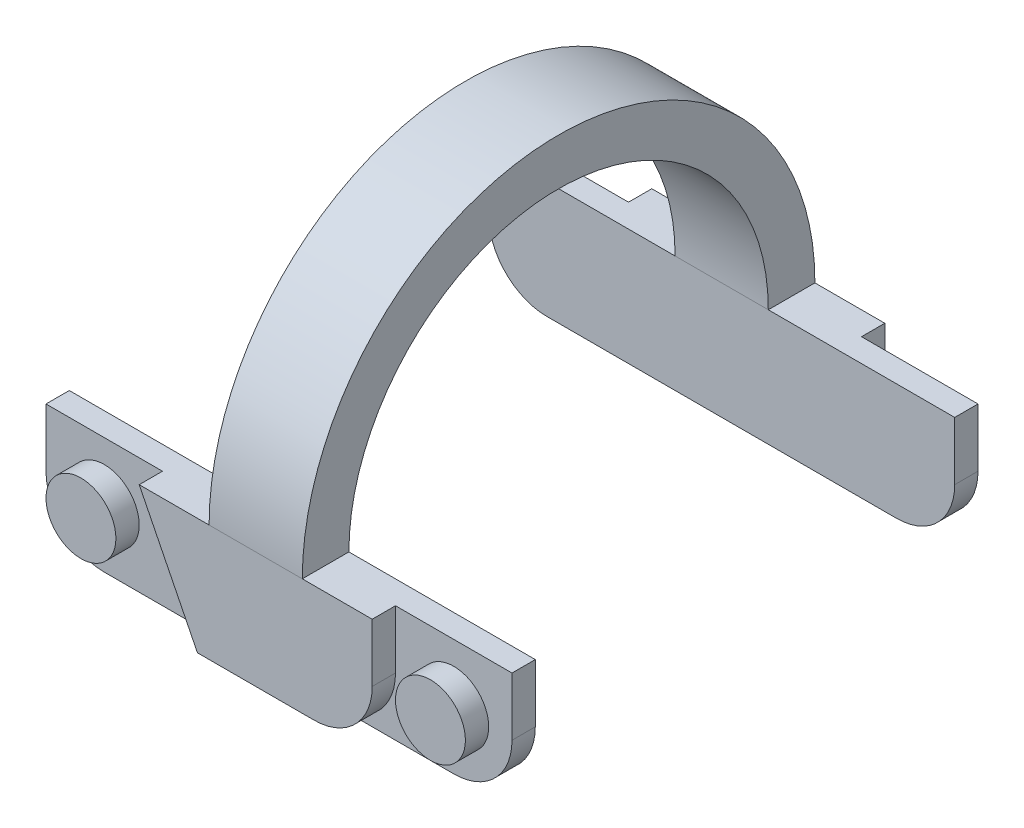
ISO-10303-21;
HEADER;
FILE_DESCRIPTION(('STEP AP214'),'2;1');
FILE_NAME('part.step','',(''),(''),'','','');
FILE_SCHEMA(('AUTOMOTIVE_DESIGN { 1 0 10303 214 1 1 1 1 }'));
ENDSEC;
DATA;
#1=APPLICATION_CONTEXT('core data for automotive mechanical design processes');
#2=APPLICATION_PROTOCOL_DEFINITION('international standard','automotive_design',2000,#1);
#3=PRODUCT_CONTEXT('',#1,'mechanical');
#4=PRODUCT('Part','Part','',(#3));
#5=PRODUCT_RELATED_PRODUCT_CATEGORY('part','',(#4));
#6=PRODUCT_DEFINITION_FORMATION('','',#4);
#7=PRODUCT_DEFINITION_CONTEXT('part definition',#1,'design');
#8=PRODUCT_DEFINITION('design','',#6,#7);
#9=PRODUCT_DEFINITION_SHAPE('','',#8);
#10=(LENGTH_UNIT() NAMED_UNIT(*) SI_UNIT(.MILLI.,.METRE.));
#11=(NAMED_UNIT(*) PLANE_ANGLE_UNIT() SI_UNIT($,.RADIAN.));
#12=(NAMED_UNIT(*) SI_UNIT($,.STERADIAN.) SOLID_ANGLE_UNIT());
#13=UNCERTAINTY_MEASURE_WITH_UNIT(LENGTH_MEASURE(1.E-05),#10,'distance_accuracy_value','');
#14=(GEOMETRIC_REPRESENTATION_CONTEXT(3) GLOBAL_UNCERTAINTY_ASSIGNED_CONTEXT((#13)) GLOBAL_UNIT_ASSIGNED_CONTEXT((#10,
#11,#12)) REPRESENTATION_CONTEXT('',''));
#15=CARTESIAN_POINT('',(0.,0.,0.));
#16=DIRECTION('',(0.,0.,1.));
#17=DIRECTION('',(1.,0.,0.));
#18=AXIS2_PLACEMENT_3D('',#15,#16,#17);
#19=CARTESIAN_POINT('',(0.,0.,10.));
#20=DIRECTION('',(0.,0.,1.));
#21=DIRECTION('',(1.,0.,0.));
#22=AXIS2_PLACEMENT_3D('',#19,#20,#21);
#23=PLANE('',#22);
#24=DIRECTION('',(0.,-1.,0.));
#25=VECTOR('',#24,1.);
#26=CARTESIAN_POINT('',(0.,2.5,10.));
#27=LINE('',#26,#25);
#28=CARTESIAN_POINT('',(0.,2.5,10.));
#29=VERTEX_POINT('',#28);
#30=CARTESIAN_POINT('',(0.,0.,10.));
#31=VERTEX_POINT('',#30);
#32=EDGE_CURVE('E326',#29,#31,#27,.T.);
#33=ORIENTED_EDGE('',*,*,#32,.T.);
#34=CARTESIAN_POINT('',(2.5,0.,10.));
#35=DIRECTION('',(0.,0.,1.));
#36=DIRECTION('',(1.,0.,0.));
#37=AXIS2_PLACEMENT_3D('',#34,#35,#36);
#38=CIRCLE('',#37,2.5);
#39=CARTESIAN_POINT('',(2.5,-2.5,10.));
#40=VERTEX_POINT('',#39);
#41=EDGE_CURVE('E389',#31,#40,#38,.T.);
#42=ORIENTED_EDGE('',*,*,#41,.T.);
#43=DIRECTION('',(1.,0.,0.));
#44=VECTOR('',#43,1.);
#45=CARTESIAN_POINT('',(0.,-2.5,10.));
#46=LINE('',#45,#44);
#47=CARTESIAN_POINT('',(7.5,-2.5,10.));
#48=VERTEX_POINT('',#47);
#49=EDGE_CURVE('E329',#40,#48,#46,.T.);
#50=ORIENTED_EDGE('',*,*,#49,.T.);
#51=DIRECTION('',(-0.447213595499958,0.894427190999916,0.));
#52=VECTOR('',#51,1.);
#53=CARTESIAN_POINT('',(5.,2.5,10.));
#54=LINE('',#53,#52);
#55=CARTESIAN_POINT('',(5.,2.5,10.));
#56=VERTEX_POINT('',#55);
#57=EDGE_CURVE('E437',#48,#56,#54,.T.);
#58=ORIENTED_EDGE('',*,*,#57,.T.);
#59=DIRECTION('',(-1.,0.,0.));
#60=VECTOR('',#59,1.);
#61=CARTESIAN_POINT('',(0.,2.5,10.));
#62=LINE('',#61,#60);
#63=EDGE_CURVE('E331',#56,#29,#62,.T.);
#64=ORIENTED_EDGE('',*,*,#63,.T.);
#65=EDGE_LOOP('',(#33,#42,#50,#58,#64));
#66=FACE_BOUND('',#65,.T.);
#67=CARTESIAN_POINT('',(2.5,0.,10.));
#68=DIRECTION('',(0.,0.,1.));
#69=DIRECTION('',(1.,0.,0.));
#70=AXIS2_PLACEMENT_3D('',#67,#68,#69);
#71=CIRCLE('',#70,1.5);
#72=CARTESIAN_POINT('',(4.,0.,10.));
#73=VERTEX_POINT('',#72);
#74=EDGE_CURVE('E444',#73,#73,#71,.T.);
#75=ORIENTED_EDGE('',*,*,#74,.F.);
#76=EDGE_LOOP('',(#75));
#77=FACE_BOUND('',#76,.T.);
#78=ADVANCED_FACE('F35',(#66,#77),#23,.T.);
#79=CARTESIAN_POINT('',(0.,0.,10.));
#80=DIRECTION('',(0.,0.,-1.));
#81=DIRECTION('',(-1.,0.,0.));
#82=AXIS2_PLACEMENT_3D('',#79,#80,#81);
#83=PLANE('',#82);
#84=DIRECTION('',(1.,0.,0.));
#85=VECTOR('',#84,1.);
#86=CARTESIAN_POINT('',(20.,-2.5,10.));
#87=LINE('',#86,#85);
#88=CARTESIAN_POINT('',(12.5,-2.5,10.));
#89=VERTEX_POINT('',#88);
#90=CARTESIAN_POINT('',(17.5,-2.5,10.));
#91=VERTEX_POINT('',#90);
#92=EDGE_CURVE('E319',#89,#91,#87,.T.);
#93=ORIENTED_EDGE('',*,*,#92,.T.);
#94=CARTESIAN_POINT('',(17.5,0.,10.));
#95=DIRECTION('',(0.,0.,-1.));
#96=DIRECTION('',(-1.,0.,0.));
#97=AXIS2_PLACEMENT_3D('',#94,#95,#96);
#98=CIRCLE('',#97,2.5);
#99=CARTESIAN_POINT('',(20.,0.,10.));
#100=VERTEX_POINT('',#99);
#101=EDGE_CURVE('E399',#91,#100,#98,.F.);
#102=ORIENTED_EDGE('',*,*,#101,.T.);
#103=DIRECTION('',(0.,1.,0.));
#104=VECTOR('',#103,1.);
#105=CARTESIAN_POINT('',(20.,2.5,10.));
#106=LINE('',#105,#104);
#107=CARTESIAN_POINT('',(20.,2.5,10.));
#108=VERTEX_POINT('',#107);
#109=EDGE_CURVE('E311',#100,#108,#106,.T.);
#110=ORIENTED_EDGE('',*,*,#109,.T.);
#111=DIRECTION('',(-1.,0.,0.));
#112=VECTOR('',#111,1.);
#113=CARTESIAN_POINT('',(20.,2.5,10.));
#114=LINE('',#113,#112);
#115=CARTESIAN_POINT('',(15.,2.5,10.));
#116=VERTEX_POINT('',#115);
#117=EDGE_CURVE('E313',#108,#116,#114,.T.);
#118=ORIENTED_EDGE('',*,*,#117,.T.);
#119=DIRECTION('',(0.,-1.,0.));
#120=VECTOR('',#119,1.);
#121=CARTESIAN_POINT('',(15.,2.5,10.));
#122=LINE('',#121,#120);
#123=CARTESIAN_POINT('',(15.,0.,10.));
#124=VERTEX_POINT('',#123);
#125=EDGE_CURVE('E316',#116,#124,#122,.T.);
#126=ORIENTED_EDGE('',*,*,#125,.T.);
#127=CARTESIAN_POINT('',(12.5,0.,10.));
#128=DIRECTION('',(0.,0.,-1.));
#129=DIRECTION('',(-1.,0.,0.));
#130=AXIS2_PLACEMENT_3D('',#127,#128,#129);
#131=CIRCLE('',#130,2.5);
#132=EDGE_CURVE('E43',#124,#89,#131,.T.);
#133=ORIENTED_EDGE('',*,*,#132,.T.);
#134=EDGE_LOOP('',(#93,#102,#110,#118,#126,#133));
#135=FACE_BOUND('',#134,.T.);
#136=CARTESIAN_POINT('',(17.5,0.,10.));
#137=DIRECTION('',(0.,0.,-1.));
#138=DIRECTION('',(-1.,0.,0.));
#139=AXIS2_PLACEMENT_3D('',#136,#137,#138);
#140=CIRCLE('',#139,1.5);
#141=CARTESIAN_POINT('',(16.,0.,10.));
#142=VERTEX_POINT('',#141);
#143=EDGE_CURVE('E362',#142,#142,#140,.F.);
#144=ORIENTED_EDGE('',*,*,#143,.F.);
#145=EDGE_LOOP('',(#144));
#146=FACE_BOUND('',#145,.T.);
#147=ADVANCED_FACE('F417',(#135,#146),#83,.F.);
#148=CARTESIAN_POINT('',(0.,0.,-10.));
#149=DIRECTION('',(0.,0.,-1.));
#150=DIRECTION('',(0.,1.,0.));
#151=AXIS2_PLACEMENT_3D('',#148,#149,#150);
#152=PLANE('',#151);
#153=DIRECTION('',(0.,-1.,0.));
#154=VECTOR('',#153,1.);
#155=CARTESIAN_POINT('',(20.,2.5,-10.));
#156=LINE('',#155,#154);
#157=CARTESIAN_POINT('',(20.,2.5,-10.));
#158=VERTEX_POINT('',#157);
#159=CARTESIAN_POINT('',(20.,0.,-10.));
#160=VERTEX_POINT('',#159);
#161=EDGE_CURVE('E239',#158,#160,#156,.T.);
#162=ORIENTED_EDGE('',*,*,#161,.T.);
#163=CARTESIAN_POINT('',(17.5,0.,-10.));
#164=DIRECTION('',(0.,0.,-1.));
#165=DIRECTION('',(0.,1.,0.));
#166=AXIS2_PLACEMENT_3D('',#163,#164,#165);
#167=CIRCLE('',#166,2.5);
#168=CARTESIAN_POINT('',(17.5,-2.5,-10.));
#169=VERTEX_POINT('',#168);
#170=EDGE_CURVE('E394',#160,#169,#167,.T.);
#171=ORIENTED_EDGE('',*,*,#170,.T.);
#172=DIRECTION('',(-1.,0.,0.));
#173=VECTOR('',#172,1.);
#174=CARTESIAN_POINT('',(20.,-2.5,-10.));
#175=LINE('',#174,#173);
#176=CARTESIAN_POINT('',(12.5,-2.5,-10.));
#177=VERTEX_POINT('',#176);
#178=EDGE_CURVE('E49',#169,#177,#175,.T.);
#179=ORIENTED_EDGE('',*,*,#178,.T.);
#180=CARTESIAN_POINT('',(12.5,0.,-10.));
#181=DIRECTION('',(0.,0.,-1.));
#182=DIRECTION('',(0.,1.,0.));
#183=AXIS2_PLACEMENT_3D('',#180,#181,#182);
#184=CIRCLE('',#183,2.5);
#185=CARTESIAN_POINT('',(15.,0.,-10.));
#186=VERTEX_POINT('',#185);
#187=EDGE_CURVE('E11',#177,#186,#184,.F.);
#188=ORIENTED_EDGE('',*,*,#187,.T.);
#189=DIRECTION('',(0.,1.,0.));
#190=VECTOR('',#189,1.);
#191=CARTESIAN_POINT('',(15.,2.5,-10.));
#192=LINE('',#191,#190);
#193=CARTESIAN_POINT('',(15.,2.5,-10.));
#194=VERTEX_POINT('',#193);
#195=EDGE_CURVE('E246',#186,#194,#192,.T.);
#196=ORIENTED_EDGE('',*,*,#195,.T.);
#197=DIRECTION('',(1.,0.,0.));
#198=VECTOR('',#197,1.);
#199=CARTESIAN_POINT('',(20.,2.5,-10.));
#200=LINE('',#199,#198);
#201=EDGE_CURVE('E248',#194,#158,#200,.T.);
#202=ORIENTED_EDGE('',*,*,#201,.T.);
#203=EDGE_LOOP('',(#162,#171,#179,#188,#196,#202));
#204=FACE_BOUND('',#203,.T.);
#205=CARTESIAN_POINT('',(17.5,0.,-10.));
#206=DIRECTION('',(0.,0.,-1.));
#207=DIRECTION('',(0.,1.,0.));
#208=AXIS2_PLACEMENT_3D('',#205,#206,#207);
#209=CIRCLE('',#208,1.5);
#210=CARTESIAN_POINT('',(17.5,1.5,-10.));
#211=VERTEX_POINT('',#210);
#212=EDGE_CURVE('E453',#211,#211,#209,.T.);
#213=ORIENTED_EDGE('',*,*,#212,.F.);
#214=EDGE_LOOP('',(#213));
#215=FACE_BOUND('',#214,.T.);
#216=ADVANCED_FACE('F474',(#204,#215),#152,.T.);
#217=CARTESIAN_POINT('',(0.,0.,-10.));
#218=DIRECTION('',(0.,0.,1.));
#219=DIRECTION('',(0.,-1.,0.));
#220=AXIS2_PLACEMENT_3D('',#217,#218,#219);
#221=PLANE('',#220);
#222=DIRECTION('',(-1.,0.,0.));
#223=VECTOR('',#222,1.);
#224=CARTESIAN_POINT('',(0.,-2.5,-10.));
#225=LINE('',#224,#223);
#226=CARTESIAN_POINT('',(7.5,-2.5,-10.));
#227=VERTEX_POINT('',#226);
#228=CARTESIAN_POINT('',(2.5,-2.5,-10.));
#229=VERTEX_POINT('',#228);
#230=EDGE_CURVE('E229',#227,#229,#225,.T.);
#231=ORIENTED_EDGE('',*,*,#230,.T.);
#232=CARTESIAN_POINT('',(2.5,0.,-10.));
#233=DIRECTION('',(0.,0.,1.));
#234=DIRECTION('',(0.,-1.,0.));
#235=AXIS2_PLACEMENT_3D('',#232,#233,#234);
#236=CIRCLE('',#235,2.5);
#237=CARTESIAN_POINT('',(0.,0.,-10.));
#238=VERTEX_POINT('',#237);
#239=EDGE_CURVE('E370',#229,#238,#236,.F.);
#240=ORIENTED_EDGE('',*,*,#239,.T.);
#241=DIRECTION('',(0.,1.,0.));
#242=VECTOR('',#241,1.);
#243=CARTESIAN_POINT('',(0.,2.5,-10.));
#244=LINE('',#243,#242);
#245=CARTESIAN_POINT('',(0.,2.5,-10.));
#246=VERTEX_POINT('',#245);
#247=EDGE_CURVE('E225',#238,#246,#244,.T.);
#248=ORIENTED_EDGE('',*,*,#247,.T.);
#249=DIRECTION('',(1.,0.,0.));
#250=VECTOR('',#249,1.);
#251=CARTESIAN_POINT('',(0.,2.5,-10.));
#252=LINE('',#251,#250);
#253=CARTESIAN_POINT('',(5.,2.5,-10.));
#254=VERTEX_POINT('',#253);
#255=EDGE_CURVE('E221',#246,#254,#252,.T.);
#256=ORIENTED_EDGE('',*,*,#255,.T.);
#257=DIRECTION('',(0.447213595499958,-0.894427190999916,0.));
#258=VECTOR('',#257,1.);
#259=CARTESIAN_POINT('',(5.,2.5,-10.));
#260=LINE('',#259,#258);
#261=EDGE_CURVE('E207',#254,#227,#260,.T.);
#262=ORIENTED_EDGE('',*,*,#261,.T.);
#263=EDGE_LOOP('',(#231,#240,#248,#256,#262));
#264=FACE_BOUND('',#263,.T.);
#265=CARTESIAN_POINT('',(2.5,0.,-10.));
#266=DIRECTION('',(0.,0.,1.));
#267=DIRECTION('',(0.,-1.,0.));
#268=AXIS2_PLACEMENT_3D('',#265,#266,#267);
#269=CIRCLE('',#268,1.5);
#270=CARTESIAN_POINT('',(2.5,-1.5,-10.));
#271=VERTEX_POINT('',#270);
#272=EDGE_CURVE('E359',#271,#271,#269,.F.);
#273=ORIENTED_EDGE('',*,*,#272,.F.);
#274=EDGE_LOOP('',(#273));
#275=FACE_BOUND('',#274,.T.);
#276=ADVANCED_FACE('F222',(#264,#275),#221,.F.);
#277=CARTESIAN_POINT('',(20.,2.5,11.));
#278=DIRECTION('',(0.,-1.,0.));
#279=DIRECTION('',(0.,0.,-1.));
#280=AXIS2_PLACEMENT_3D('',#277,#278,#279);
#281=PLANE('',#280);
#282=DIRECTION('',(0.,0.,1.));
#283=VECTOR('',#282,1.);
#284=CARTESIAN_POINT('',(8.,2.5,9.));
#285=LINE('',#284,#283);
#286=CARTESIAN_POINT('',(8.,2.5,9.));
#287=VERTEX_POINT('',#286);
#288=CARTESIAN_POINT('',(8.,2.5,11.));
#289=VERTEX_POINT('',#288);
#290=EDGE_CURVE('E275',#287,#289,#285,.T.);
#291=ORIENTED_EDGE('',*,*,#290,.F.);
#292=DIRECTION('',(-1.,0.,0.));
#293=VECTOR('',#292,1.);
#294=CARTESIAN_POINT('',(20.,2.5,9.));
#295=LINE('',#294,#293);
#296=CARTESIAN_POINT('',(0.,2.5,9.));
#297=VERTEX_POINT('',#296);
#298=EDGE_CURVE('E350',#287,#297,#295,.T.);
#299=ORIENTED_EDGE('',*,*,#298,.T.);
#300=DIRECTION('',(0.,0.,1.));
#301=VECTOR('',#300,1.);
#302=CARTESIAN_POINT('',(0.,2.5,11.));
#303=LINE('',#302,#301);
#304=EDGE_CURVE('E340',#297,#29,#303,.T.);
#305=ORIENTED_EDGE('',*,*,#304,.T.);
#306=ORIENTED_EDGE('',*,*,#63,.F.);
#307=DIRECTION('',(0.,0.,1.));
#308=VECTOR('',#307,1.);
#309=CARTESIAN_POINT('',(5.,2.5,10.));
#310=LINE('',#309,#308);
#311=CARTESIAN_POINT('',(5.,2.5,11.));
#312=VERTEX_POINT('',#311);
#313=EDGE_CURVE('E333',#56,#312,#310,.T.);
#314=ORIENTED_EDGE('',*,*,#313,.T.);
#315=DIRECTION('',(-1.,0.,0.));
#316=VECTOR('',#315,1.);
#317=CARTESIAN_POINT('',(20.,2.5,11.));
#318=LINE('',#317,#316);
#319=EDGE_CURVE('E343',#289,#312,#318,.T.);
#320=ORIENTED_EDGE('',*,*,#319,.F.);
#321=EDGE_LOOP('',(#291,#299,#305,#306,#314,#320));
#322=FACE_BOUND('',#321,.T.);
#323=ADVANCED_FACE('F473',(#322),#281,.F.);
#324=DIRECTION('',(0.,0.,-1.));
#325=VECTOR('',#324,1.);
#326=CARTESIAN_POINT('',(12.,2.5,9.));
#327=LINE('',#326,#325);
#328=CARTESIAN_POINT('',(12.,2.5,11.));
#329=VERTEX_POINT('',#328);
#330=CARTESIAN_POINT('',(12.,2.5,9.));
#331=VERTEX_POINT('',#330);
#332=EDGE_CURVE('E281',#329,#331,#327,.T.);
#333=ORIENTED_EDGE('',*,*,#332,.F.);
#334=CARTESIAN_POINT('',(15.,2.5,11.));
#335=VERTEX_POINT('',#334);
#336=EDGE_CURVE('E347',#335,#329,#318,.T.);
#337=ORIENTED_EDGE('',*,*,#336,.F.);
#338=DIRECTION('',(0.,0.,1.));
#339=VECTOR('',#338,1.);
#340=CARTESIAN_POINT('',(15.,2.5,10.));
#341=LINE('',#340,#339);
#342=EDGE_CURVE('E322',#116,#335,#341,.T.);
#343=ORIENTED_EDGE('',*,*,#342,.F.);
#344=ORIENTED_EDGE('',*,*,#117,.F.);
#345=DIRECTION('',(0.,0.,1.));
#346=VECTOR('',#345,1.);
#347=CARTESIAN_POINT('',(20.,2.5,11.));
#348=LINE('',#347,#346);
#349=CARTESIAN_POINT('',(20.,2.5,9.));
#350=VERTEX_POINT('',#349);
#351=EDGE_CURVE('E339',#350,#108,#348,.T.);
#352=ORIENTED_EDGE('',*,*,#351,.F.);
#353=EDGE_CURVE('E351',#350,#331,#295,.T.);
#354=ORIENTED_EDGE('',*,*,#353,.T.);
#355=EDGE_LOOP('',(#333,#337,#343,#344,#352,#354));
#356=FACE_BOUND('',#355,.T.);
#357=ADVANCED_FACE('F480',(#356),#281,.F.);
#358=CARTESIAN_POINT('',(0.,0.,0.));
#359=DIRECTION('',(1.,0.,0.));
#360=DIRECTION('',(0.,0.,-1.));
#361=AXIS2_PLACEMENT_3D('',#358,#359,#360);
#362=PLANE('',#361);
#363=DIRECTION('',(0.,1.,0.));
#364=VECTOR('',#363,1.);
#365=CARTESIAN_POINT('',(0.,2.5,9.));
#366=LINE('',#365,#364);
#367=CARTESIAN_POINT('',(0.,0.,9.));
#368=VERTEX_POINT('',#367);
#369=EDGE_CURVE('E336',#368,#297,#366,.T.);
#370=ORIENTED_EDGE('',*,*,#369,.F.);
#371=DIRECTION('',(0.,0.,-1.));
#372=VECTOR('',#371,1.);
#373=CARTESIAN_POINT('',(0.,0.,0.));
#374=LINE('',#373,#372);
#375=EDGE_CURVE('E387',#368,#31,#374,.F.);
#376=ORIENTED_EDGE('',*,*,#375,.T.);
#377=ORIENTED_EDGE('',*,*,#32,.F.);
#378=ORIENTED_EDGE('',*,*,#304,.F.);
#379=EDGE_LOOP('',(#370,#376,#377,#378));
#380=FACE_BOUND('',#379,.T.);
#381=ADVANCED_FACE('F500',(#380),#362,.F.);
#382=CARTESIAN_POINT('',(20.,2.5,11.));
#383=DIRECTION('',(0.,0.,-1.));
#384=DIRECTION('',(0.,1.,0.));
#385=AXIS2_PLACEMENT_3D('',#382,#383,#384);
#386=PLANE('',#385);
#387=DIRECTION('',(-1.,0.,0.));
#388=VECTOR('',#387,1.);
#389=CARTESIAN_POINT('',(20.,-2.5,11.));
#390=LINE('',#389,#388);
#391=CARTESIAN_POINT('',(12.5,-2.5,11.));
#392=VERTEX_POINT('',#391);
#393=CARTESIAN_POINT('',(7.5,-2.5,11.));
#394=VERTEX_POINT('',#393);
#395=EDGE_CURVE('E357',#392,#394,#390,.T.);
#396=ORIENTED_EDGE('',*,*,#395,.F.);
#397=CARTESIAN_POINT('',(12.5,0.,11.));
#398=DIRECTION('',(0.,0.,-1.));
#399=DIRECTION('',(0.,1.,0.));
#400=AXIS2_PLACEMENT_3D('',#397,#398,#399);
#401=CIRCLE('',#400,2.5);
#402=CARTESIAN_POINT('',(15.,0.,11.));
#403=VERTEX_POINT('',#402);
#404=EDGE_CURVE('E404',#392,#403,#401,.F.);
#405=ORIENTED_EDGE('',*,*,#404,.T.);
#406=DIRECTION('',(0.,-1.,0.));
#407=VECTOR('',#406,1.);
#408=CARTESIAN_POINT('',(15.,2.5,11.));
#409=LINE('',#408,#407);
#410=EDGE_CURVE('E310',#335,#403,#409,.T.);
#411=ORIENTED_EDGE('',*,*,#410,.F.);
#412=ORIENTED_EDGE('',*,*,#336,.T.);
#413=DIRECTION('',(1.,0.,0.));
#414=VECTOR('',#413,1.);
#415=CARTESIAN_POINT('',(8.,2.5,11.));
#416=LINE('',#415,#414);
#417=EDGE_CURVE('E278',#289,#329,#416,.T.);
#418=ORIENTED_EDGE('',*,*,#417,.F.);
#419=ORIENTED_EDGE('',*,*,#319,.T.);
#420=DIRECTION('',(-0.447213595499958,0.894427190999916,0.));
#421=VECTOR('',#420,1.);
#422=CARTESIAN_POINT('',(5.,2.5,11.));
#423=LINE('',#422,#421);
#424=EDGE_CURVE('E433',#394,#312,#423,.T.);
#425=ORIENTED_EDGE('',*,*,#424,.F.);
#426=EDGE_LOOP('',(#396,#405,#411,#412,#418,#419,#425));
#427=FACE_BOUND('',#426,.T.);
#428=ADVANCED_FACE('F430',(#427),#386,.F.);
#429=CARTESIAN_POINT('',(20.,-2.5,11.));
#430=DIRECTION('',(0.,1.,0.));
#431=DIRECTION('',(0.,0.,1.));
#432=AXIS2_PLACEMENT_3D('',#429,#430,#431);
#433=PLANE('',#432);
#434=ORIENTED_EDGE('',*,*,#92,.F.);
#435=DIRECTION('',(0.,0.,1.));
#436=VECTOR('',#435,1.);
#437=CARTESIAN_POINT('',(12.5,-2.5,11.));
#438=LINE('',#437,#436);
#439=EDGE_CURVE('E401',#89,#392,#438,.T.);
#440=ORIENTED_EDGE('',*,*,#439,.T.);
#441=ORIENTED_EDGE('',*,*,#395,.T.);
#442=DIRECTION('',(0.,0.,1.));
#443=VECTOR('',#442,1.);
#444=CARTESIAN_POINT('',(7.5,-2.5,10.));
#445=LINE('',#444,#443);
#446=EDGE_CURVE('E439',#48,#394,#445,.T.);
#447=ORIENTED_EDGE('',*,*,#446,.F.);
#448=ORIENTED_EDGE('',*,*,#49,.F.);
#449=DIRECTION('',(0.,0.,-1.));
#450=VECTOR('',#449,1.);
#451=CARTESIAN_POINT('',(2.5,-2.5,11.));
#452=LINE('',#451,#450);
#453=CARTESIAN_POINT('',(2.5,-2.5,9.));
#454=VERTEX_POINT('',#453);
#455=EDGE_CURVE('E380',#40,#454,#452,.T.);
#456=ORIENTED_EDGE('',*,*,#455,.T.);
#457=DIRECTION('',(-1.,0.,0.));
#458=VECTOR('',#457,1.);
#459=CARTESIAN_POINT('',(20.,-2.5,9.));
#460=LINE('',#459,#458);
#461=CARTESIAN_POINT('',(17.5,-2.5,9.));
#462=VERTEX_POINT('',#461);
#463=EDGE_CURVE('E354',#462,#454,#460,.T.);
#464=ORIENTED_EDGE('',*,*,#463,.F.);
#465=DIRECTION('',(0.,0.,-1.));
#466=VECTOR('',#465,1.);
#467=CARTESIAN_POINT('',(17.5,-2.5,10.));
#468=LINE('',#467,#466);
#469=EDGE_CURVE('E378',#462,#91,#468,.F.);
#470=ORIENTED_EDGE('',*,*,#469,.T.);
#471=EDGE_LOOP('',(#434,#440,#441,#447,#448,#456,#464,#470));
#472=FACE_BOUND('',#471,.T.);
#473=ADVANCED_FACE('F425',(#472),#433,.F.);
#474=CARTESIAN_POINT('',(20.,2.5,9.));
#475=DIRECTION('',(0.,0.,1.));
#476=DIRECTION('',(1.,0.,0.));
#477=AXIS2_PLACEMENT_3D('',#474,#475,#476);
#478=PLANE('',#477);
#479=ORIENTED_EDGE('',*,*,#463,.T.);
#480=CARTESIAN_POINT('',(2.5,0.,9.));
#481=DIRECTION('',(0.,0.,1.));
#482=DIRECTION('',(1.,0.,0.));
#483=AXIS2_PLACEMENT_3D('',#480,#481,#482);
#484=CIRCLE('',#483,2.5);
#485=EDGE_CURVE('E385',#454,#368,#484,.F.);
#486=ORIENTED_EDGE('',*,*,#485,.T.);
#487=ORIENTED_EDGE('',*,*,#369,.T.);
#488=ORIENTED_EDGE('',*,*,#298,.F.);
#489=DIRECTION('',(-1.,0.,0.));
#490=VECTOR('',#489,1.);
#491=CARTESIAN_POINT('',(8.,2.5,9.));
#492=LINE('',#491,#490);
#493=EDGE_CURVE('E284',#331,#287,#492,.T.);
#494=ORIENTED_EDGE('',*,*,#493,.F.);
#495=ORIENTED_EDGE('',*,*,#353,.F.);
#496=DIRECTION('',(0.,1.,0.));
#497=VECTOR('',#496,1.);
#498=CARTESIAN_POINT('',(20.,2.5,9.));
#499=LINE('',#498,#497);
#500=CARTESIAN_POINT('',(20.,0.,9.));
#501=VERTEX_POINT('',#500);
#502=EDGE_CURVE('E337',#501,#350,#499,.T.);
#503=ORIENTED_EDGE('',*,*,#502,.F.);
#504=CARTESIAN_POINT('',(17.5,0.,9.));
#505=DIRECTION('',(0.,0.,1.));
#506=DIRECTION('',(1.,0.,0.));
#507=AXIS2_PLACEMENT_3D('',#504,#505,#506);
#508=CIRCLE('',#507,2.5);
#509=EDGE_CURVE('E383',#501,#462,#508,.F.);
#510=ORIENTED_EDGE('',*,*,#509,.T.);
#511=EDGE_LOOP('',(#479,#486,#487,#488,#494,#495,#503,#510));
#512=FACE_BOUND('',#511,.T.);
#513=ADVANCED_FACE('F498',(#512),#478,.F.);
#514=CARTESIAN_POINT('',(20.,0.,0.));
#515=DIRECTION('',(1.,0.,0.));
#516=DIRECTION('',(0.,0.,-1.));
#517=AXIS2_PLACEMENT_3D('',#514,#515,#516);
#518=PLANE('',#517);
#519=ORIENTED_EDGE('',*,*,#109,.F.);
#520=DIRECTION('',(0.,0.,-1.));
#521=VECTOR('',#520,1.);
#522=CARTESIAN_POINT('',(20.,0.,9.));
#523=LINE('',#522,#521);
#524=EDGE_CURVE('E396',#100,#501,#523,.T.);
#525=ORIENTED_EDGE('',*,*,#524,.T.);
#526=ORIENTED_EDGE('',*,*,#502,.T.);
#527=ORIENTED_EDGE('',*,*,#351,.T.);
#528=EDGE_LOOP('',(#519,#525,#526,#527));
#529=FACE_BOUND('',#528,.T.);
#530=ADVANCED_FACE('F495',(#529),#518,.T.);
#531=CARTESIAN_POINT('',(15.,2.5,10.));
#532=DIRECTION('',(-1.,0.,0.));
#533=DIRECTION('',(0.,0.,1.));
#534=AXIS2_PLACEMENT_3D('',#531,#532,#533);
#535=PLANE('',#534);
#536=ORIENTED_EDGE('',*,*,#410,.T.);
#537=DIRECTION('',(0.,0.,1.));
#538=VECTOR('',#537,1.);
#539=CARTESIAN_POINT('',(15.,0.,10.));
#540=LINE('',#539,#538);
#541=EDGE_CURVE('E406',#403,#124,#540,.F.);
#542=ORIENTED_EDGE('',*,*,#541,.T.);
#543=ORIENTED_EDGE('',*,*,#125,.F.);
#544=ORIENTED_EDGE('',*,*,#342,.T.);
#545=EDGE_LOOP('',(#536,#542,#543,#544));
#546=FACE_BOUND('',#545,.T.);
#547=ADVANCED_FACE('F494',(#546),#535,.F.);
#548=CARTESIAN_POINT('',(8.,2.5,-9.));
#549=DIRECTION('',(1.,0.,0.));
#550=DIRECTION('',(0.,0.,-1.));
#551=AXIS2_PLACEMENT_3D('',#548,#549,#550);
#552=PLANE('',#551);
#553=CARTESIAN_POINT('',(8.,2.5,0.));
#554=DIRECTION('',(1.,0.,0.));
#555=DIRECTION('',(0.,0.,-1.));
#556=AXIS2_PLACEMENT_3D('',#553,#554,#555);
#557=CIRCLE('',#556,11.);
#558=CARTESIAN_POINT('',(8.,2.5,-11.));
#559=VERTEX_POINT('',#558);
#560=EDGE_CURVE('E307',#559,#289,#557,.T.);
#561=ORIENTED_EDGE('',*,*,#560,.F.);
#562=DIRECTION('',(0.,0.,-1.));
#563=VECTOR('',#562,1.);
#564=CARTESIAN_POINT('',(8.,2.5,-9.));
#565=LINE('',#564,#563);
#566=CARTESIAN_POINT('',(8.,2.5,-9.));
#567=VERTEX_POINT('',#566);
#568=EDGE_CURVE('E287',#567,#559,#565,.T.);
#569=ORIENTED_EDGE('',*,*,#568,.F.);
#570=CARTESIAN_POINT('',(8.,2.5,0.));
#571=DIRECTION('',(1.,0.,0.));
#572=DIRECTION('',(0.,0.,-1.));
#573=AXIS2_PLACEMENT_3D('',#570,#571,#572);
#574=CIRCLE('',#573,9.);
#575=EDGE_CURVE('E298',#567,#287,#574,.T.);
#576=ORIENTED_EDGE('',*,*,#575,.T.);
#577=ORIENTED_EDGE('',*,*,#290,.T.);
#578=EDGE_LOOP('',(#561,#569,#576,#577));
#579=FACE_BOUND('',#578,.T.);
#580=ADVANCED_FACE('F678',(#579),#552,.F.);
#581=CARTESIAN_POINT('',(10.,2.5,0.));
#582=DIRECTION('',(1.,0.,0.));
#583=DIRECTION('',(0.,0.,-1.));
#584=AXIS2_PLACEMENT_3D('',#581,#582,#583);
#585=CYLINDRICAL_SURFACE('',#584,11.);
#586=CARTESIAN_POINT('',(12.,2.5,0.));
#587=DIRECTION('',(1.,0.,0.));
#588=DIRECTION('',(0.,0.,-1.));
#589=AXIS2_PLACEMENT_3D('',#586,#587,#588);
#590=CIRCLE('',#589,11.);
#591=CARTESIAN_POINT('',(12.,2.5,-11.));
#592=VERTEX_POINT('',#591);
#593=EDGE_CURVE('E304',#592,#329,#590,.T.);
#594=ORIENTED_EDGE('',*,*,#593,.F.);
#595=DIRECTION('',(1.,0.,0.));
#596=VECTOR('',#595,1.);
#597=CARTESIAN_POINT('',(8.,2.5,-11.));
#598=LINE('',#597,#596);
#599=EDGE_CURVE('E289',#559,#592,#598,.T.);
#600=ORIENTED_EDGE('',*,*,#599,.F.);
#601=ORIENTED_EDGE('',*,*,#560,.T.);
#602=ORIENTED_EDGE('',*,*,#417,.T.);
#603=EDGE_LOOP('',(#594,#600,#601,#602));
#604=FACE_BOUND('',#603,.T.);
#605=ADVANCED_FACE('F777',(#604),#585,.T.);
#606=CARTESIAN_POINT('',(12.,2.5,-9.));
#607=DIRECTION('',(-1.,0.,0.));
#608=DIRECTION('',(0.,0.,1.));
#609=AXIS2_PLACEMENT_3D('',#606,#607,#608);
#610=PLANE('',#609);
#611=CARTESIAN_POINT('',(12.,2.5,0.));
#612=DIRECTION('',(1.,0.,0.));
#613=DIRECTION('',(0.,0.,-1.));
#614=AXIS2_PLACEMENT_3D('',#611,#612,#613);
#615=CIRCLE('',#614,9.);
#616=CARTESIAN_POINT('',(12.,2.5,-9.));
#617=VERTEX_POINT('',#616);
#618=EDGE_CURVE('E301',#617,#331,#615,.T.);
#619=ORIENTED_EDGE('',*,*,#618,.F.);
#620=DIRECTION('',(0.,0.,1.));
#621=VECTOR('',#620,1.);
#622=CARTESIAN_POINT('',(12.,2.5,-9.));
#623=LINE('',#622,#621);
#624=EDGE_CURVE('E292',#592,#617,#623,.T.);
#625=ORIENTED_EDGE('',*,*,#624,.F.);
#626=ORIENTED_EDGE('',*,*,#593,.T.);
#627=ORIENTED_EDGE('',*,*,#332,.T.);
#628=EDGE_LOOP('',(#619,#625,#626,#627));
#629=FACE_BOUND('',#628,.T.);
#630=ADVANCED_FACE('F787',(#629),#610,.F.);
#631=CARTESIAN_POINT('',(10.,2.5,0.));
#632=DIRECTION('',(1.,0.,0.));
#633=DIRECTION('',(0.,0.,-1.));
#634=AXIS2_PLACEMENT_3D('',#631,#632,#633);
#635=CYLINDRICAL_SURFACE('',#634,9.);
#636=DIRECTION('',(-1.,0.,0.));
#637=VECTOR('',#636,1.);
#638=CARTESIAN_POINT('',(8.,2.5,-9.));
#639=LINE('',#638,#637);
#640=EDGE_CURVE('E295',#617,#567,#639,.T.);
#641=ORIENTED_EDGE('',*,*,#640,.F.);
#642=ORIENTED_EDGE('',*,*,#618,.T.);
#643=ORIENTED_EDGE('',*,*,#493,.T.);
#644=ORIENTED_EDGE('',*,*,#575,.F.);
#645=EDGE_LOOP('',(#641,#642,#643,#644));
#646=FACE_BOUND('',#645,.T.);
#647=ADVANCED_FACE('F634',(#646),#635,.F.);
#648=CARTESIAN_POINT('',(20.,2.5,-11.));
#649=DIRECTION('',(0.,-1.,0.));
#650=DIRECTION('',(0.,0.,-1.));
#651=AXIS2_PLACEMENT_3D('',#648,#649,#650);
#652=PLANE('',#651);
#653=DIRECTION('',(-1.,0.,0.));
#654=VECTOR('',#653,1.);
#655=CARTESIAN_POINT('',(20.,2.5,-9.));
#656=LINE('',#655,#654);
#657=CARTESIAN_POINT('',(0.,2.5,-9.));
#658=VERTEX_POINT('',#657);
#659=EDGE_CURVE('E268',#567,#658,#656,.T.);
#660=ORIENTED_EDGE('',*,*,#659,.F.);
#661=ORIENTED_EDGE('',*,*,#568,.T.);
#662=DIRECTION('',(-1.,0.,0.));
#663=VECTOR('',#662,1.);
#664=CARTESIAN_POINT('',(20.,2.5,-11.));
#665=LINE('',#664,#663);
#666=CARTESIAN_POINT('',(5.,2.5,-11.));
#667=VERTEX_POINT('',#666);
#668=EDGE_CURVE('E236',#559,#667,#665,.T.);
#669=ORIENTED_EDGE('',*,*,#668,.T.);
#670=DIRECTION('',(0.,0.,-1.));
#671=VECTOR('',#670,1.);
#672=CARTESIAN_POINT('',(5.,2.5,-10.));
#673=LINE('',#672,#671);
#674=EDGE_CURVE('E212',#254,#667,#673,.T.);
#675=ORIENTED_EDGE('',*,*,#674,.F.);
#676=ORIENTED_EDGE('',*,*,#255,.F.);
#677=DIRECTION('',(0.,0.,1.));
#678=VECTOR('',#677,1.);
#679=CARTESIAN_POINT('',(0.,2.5,-11.));
#680=LINE('',#679,#678);
#681=EDGE_CURVE('E253',#246,#658,#680,.T.);
#682=ORIENTED_EDGE('',*,*,#681,.T.);
#683=EDGE_LOOP('',(#660,#661,#669,#675,#676,#682));
#684=FACE_BOUND('',#683,.T.);
#685=ADVANCED_FACE('F233',(#684),#652,.F.);
#686=CARTESIAN_POINT('',(15.,2.5,-11.));
#687=VERTEX_POINT('',#686);
#688=EDGE_CURVE('E272',#687,#592,#665,.T.);
#689=ORIENTED_EDGE('',*,*,#688,.T.);
#690=ORIENTED_EDGE('',*,*,#624,.T.);
#691=CARTESIAN_POINT('',(20.,2.5,-9.));
#692=VERTEX_POINT('',#691);
#693=EDGE_CURVE('E269',#692,#617,#656,.T.);
#694=ORIENTED_EDGE('',*,*,#693,.F.);
#695=DIRECTION('',(0.,0.,1.));
#696=VECTOR('',#695,1.);
#697=CARTESIAN_POINT('',(20.,2.5,-11.));
#698=LINE('',#697,#696);
#699=EDGE_CURVE('E254',#158,#692,#698,.T.);
#700=ORIENTED_EDGE('',*,*,#699,.F.);
#701=ORIENTED_EDGE('',*,*,#201,.F.);
#702=DIRECTION('',(0.,0.,-1.));
#703=VECTOR('',#702,1.);
#704=CARTESIAN_POINT('',(15.,2.5,-10.));
#705=LINE('',#704,#703);
#706=EDGE_CURVE('E249',#194,#687,#705,.T.);
#707=ORIENTED_EDGE('',*,*,#706,.T.);
#708=EDGE_LOOP('',(#689,#690,#694,#700,#701,#707));
#709=FACE_BOUND('',#708,.T.);
#710=ADVANCED_FACE('F633',(#709),#652,.F.);
#711=CARTESIAN_POINT('',(20.,0.,0.));
#712=DIRECTION('',(-1.,0.,0.));
#713=DIRECTION('',(0.,0.,1.));
#714=AXIS2_PLACEMENT_3D('',#711,#712,#713);
#715=PLANE('',#714);
#716=DIRECTION('',(0.,-1.,0.));
#717=VECTOR('',#716,1.);
#718=CARTESIAN_POINT('',(20.,2.5,-9.));
#719=LINE('',#718,#717);
#720=CARTESIAN_POINT('',(20.,0.,-9.));
#721=VERTEX_POINT('',#720);
#722=EDGE_CURVE('E256',#692,#721,#719,.T.);
#723=ORIENTED_EDGE('',*,*,#722,.T.);
#724=DIRECTION('',(0.,0.,-1.));
#725=VECTOR('',#724,1.);
#726=CARTESIAN_POINT('',(20.,0.,0.));
#727=LINE('',#726,#725);
#728=EDGE_CURVE('E391',#721,#160,#727,.T.);
#729=ORIENTED_EDGE('',*,*,#728,.T.);
#730=ORIENTED_EDGE('',*,*,#161,.F.);
#731=ORIENTED_EDGE('',*,*,#699,.T.);
#732=EDGE_LOOP('',(#723,#729,#730,#731));
#733=FACE_BOUND('',#732,.T.);
#734=ADVANCED_FACE('F692',(#733),#715,.F.);
#735=CARTESIAN_POINT('',(20.,2.5,-11.));
#736=DIRECTION('',(0.,0.,1.));
#737=DIRECTION('',(0.,-1.,0.));
#738=AXIS2_PLACEMENT_3D('',#735,#736,#737);
#739=PLANE('',#738);
#740=DIRECTION('',(0.,1.,0.));
#741=VECTOR('',#740,1.);
#742=CARTESIAN_POINT('',(15.,2.5,-11.));
#743=LINE('',#742,#741);
#744=CARTESIAN_POINT('',(15.,0.,-11.));
#745=VERTEX_POINT('',#744);
#746=EDGE_CURVE('E237',#745,#687,#743,.T.);
#747=ORIENTED_EDGE('',*,*,#746,.F.);
#748=CARTESIAN_POINT('',(12.5,0.,-11.));
#749=DIRECTION('',(0.,0.,1.));
#750=DIRECTION('',(0.,-1.,0.));
#751=AXIS2_PLACEMENT_3D('',#748,#749,#750);
#752=CIRCLE('',#751,2.5);
#753=CARTESIAN_POINT('',(12.5,-2.5,-11.));
#754=VERTEX_POINT('',#753);
#755=EDGE_CURVE('E57',#745,#754,#752,.F.);
#756=ORIENTED_EDGE('',*,*,#755,.T.);
#757=DIRECTION('',(-1.,0.,0.));
#758=VECTOR('',#757,1.);
#759=CARTESIAN_POINT('',(20.,-2.5,-11.));
#760=LINE('',#759,#758);
#761=CARTESIAN_POINT('',(7.5,-2.5,-11.));
#762=VERTEX_POINT('',#761);
#763=EDGE_CURVE('E260',#754,#762,#760,.T.);
#764=ORIENTED_EDGE('',*,*,#763,.T.);
#765=DIRECTION('',(0.447213595499958,-0.894427190999916,0.));
#766=VECTOR('',#765,1.);
#767=CARTESIAN_POINT('',(5.,2.5,-11.));
#768=LINE('',#767,#766);
#769=EDGE_CURVE('E218',#667,#762,#768,.T.);
#770=ORIENTED_EDGE('',*,*,#769,.F.);
#771=ORIENTED_EDGE('',*,*,#668,.F.);
#772=ORIENTED_EDGE('',*,*,#599,.T.);
#773=ORIENTED_EDGE('',*,*,#688,.F.);
#774=EDGE_LOOP('',(#747,#756,#764,#770,#771,#772,#773));
#775=FACE_BOUND('',#774,.T.);
#776=ADVANCED_FACE('F686',(#775),#739,.F.);
#777=CARTESIAN_POINT('',(20.,2.5,-9.));
#778=DIRECTION('',(0.,0.,-1.));
#779=DIRECTION('',(-1.,0.,0.));
#780=AXIS2_PLACEMENT_3D('',#777,#778,#779);
#781=PLANE('',#780);
#782=DIRECTION('',(0.,-1.,0.));
#783=VECTOR('',#782,1.);
#784=CARTESIAN_POINT('',(0.,2.5,-9.));
#785=LINE('',#784,#783);
#786=CARTESIAN_POINT('',(0.,0.,-9.));
#787=VERTEX_POINT('',#786);
#788=EDGE_CURVE('E257',#658,#787,#785,.T.);
#789=ORIENTED_EDGE('',*,*,#788,.T.);
#790=CARTESIAN_POINT('',(2.5,0.,-9.));
#791=DIRECTION('',(0.,0.,-1.));
#792=DIRECTION('',(-1.,0.,0.));
#793=AXIS2_PLACEMENT_3D('',#790,#791,#792);
#794=CIRCLE('',#793,2.5);
#795=CARTESIAN_POINT('',(2.5,-2.5,-9.));
#796=VERTEX_POINT('',#795);
#797=EDGE_CURVE('E376',#787,#796,#794,.F.);
#798=ORIENTED_EDGE('',*,*,#797,.T.);
#799=DIRECTION('',(-1.,0.,0.));
#800=VECTOR('',#799,1.);
#801=CARTESIAN_POINT('',(20.,-2.5,-9.));
#802=LINE('',#801,#800);
#803=CARTESIAN_POINT('',(17.5,-2.5,-9.));
#804=VERTEX_POINT('',#803);
#805=EDGE_CURVE('E265',#804,#796,#802,.T.);
#806=ORIENTED_EDGE('',*,*,#805,.F.);
#807=CARTESIAN_POINT('',(17.5,0.,-9.));
#808=DIRECTION('',(0.,0.,-1.));
#809=DIRECTION('',(-1.,0.,0.));
#810=AXIS2_PLACEMENT_3D('',#807,#808,#809);
#811=CIRCLE('',#810,2.5);
#812=EDGE_CURVE('E374',#804,#721,#811,.F.);
#813=ORIENTED_EDGE('',*,*,#812,.T.);
#814=ORIENTED_EDGE('',*,*,#722,.F.);
#815=ORIENTED_EDGE('',*,*,#693,.T.);
#816=ORIENTED_EDGE('',*,*,#640,.T.);
#817=ORIENTED_EDGE('',*,*,#659,.T.);
#818=EDGE_LOOP('',(#789,#798,#806,#813,#814,#815,#816,#817));
#819=FACE_BOUND('',#818,.T.);
#820=ADVANCED_FACE('F691',(#819),#781,.F.);
#821=CARTESIAN_POINT('',(20.,-2.5,-11.));
#822=DIRECTION('',(0.,1.,0.));
#823=DIRECTION('',(0.,0.,1.));
#824=AXIS2_PLACEMENT_3D('',#821,#822,#823);
#825=PLANE('',#824);
#826=ORIENTED_EDGE('',*,*,#763,.F.);
#827=DIRECTION('',(0.,0.,-1.));
#828=VECTOR('',#827,1.);
#829=CARTESIAN_POINT('',(12.5,-2.5,-11.));
#830=LINE('',#829,#828);
#831=EDGE_CURVE('E412',#754,#177,#830,.F.);
#832=ORIENTED_EDGE('',*,*,#831,.T.);
#833=ORIENTED_EDGE('',*,*,#178,.F.);
#834=DIRECTION('',(0.,0.,-1.));
#835=VECTOR('',#834,1.);
#836=CARTESIAN_POINT('',(17.5,-2.5,-11.));
#837=LINE('',#836,#835);
#838=EDGE_CURVE('E365',#169,#804,#837,.F.);
#839=ORIENTED_EDGE('',*,*,#838,.T.);
#840=ORIENTED_EDGE('',*,*,#805,.T.);
#841=DIRECTION('',(0.,0.,-1.));
#842=VECTOR('',#841,1.);
#843=CARTESIAN_POINT('',(2.5,-2.5,-10.));
#844=LINE('',#843,#842);
#845=EDGE_CURVE('E367',#796,#229,#844,.T.);
#846=ORIENTED_EDGE('',*,*,#845,.T.);
#847=ORIENTED_EDGE('',*,*,#230,.F.);
#848=DIRECTION('',(0.,0.,-1.));
#849=VECTOR('',#848,1.);
#850=CARTESIAN_POINT('',(7.5,-2.5,-10.));
#851=LINE('',#850,#849);
#852=EDGE_CURVE('E215',#227,#762,#851,.T.);
#853=ORIENTED_EDGE('',*,*,#852,.T.);
#854=EDGE_LOOP('',(#826,#832,#833,#839,#840,#846,#847,#853));
#855=FACE_BOUND('',#854,.T.);
#856=ADVANCED_FACE('F701',(#855),#825,.F.);
#857=CARTESIAN_POINT('',(0.,0.,0.));
#858=DIRECTION('',(-1.,0.,0.));
#859=DIRECTION('',(0.,0.,1.));
#860=AXIS2_PLACEMENT_3D('',#857,#858,#859);
#861=PLANE('',#860);
#862=ORIENTED_EDGE('',*,*,#247,.F.);
#863=DIRECTION('',(0.,0.,-1.));
#864=VECTOR('',#863,1.);
#865=CARTESIAN_POINT('',(0.,0.,-9.));
#866=LINE('',#865,#864);
#867=EDGE_CURVE('E372',#238,#787,#866,.F.);
#868=ORIENTED_EDGE('',*,*,#867,.T.);
#869=ORIENTED_EDGE('',*,*,#788,.F.);
#870=ORIENTED_EDGE('',*,*,#681,.F.);
#871=EDGE_LOOP('',(#862,#868,#869,#870));
#872=FACE_BOUND('',#871,.T.);
#873=ADVANCED_FACE('F706',(#872),#861,.T.);
#874=CARTESIAN_POINT('',(15.,2.5,-10.));
#875=DIRECTION('',(-1.,0.,0.));
#876=DIRECTION('',(0.,0.,1.));
#877=AXIS2_PLACEMENT_3D('',#874,#875,#876);
#878=PLANE('',#877);
#879=ORIENTED_EDGE('',*,*,#195,.F.);
#880=DIRECTION('',(0.,0.,-1.));
#881=VECTOR('',#880,1.);
#882=CARTESIAN_POINT('',(15.,0.,-10.));
#883=LINE('',#882,#881);
#884=EDGE_CURVE('E408',#186,#745,#883,.T.);
#885=ORIENTED_EDGE('',*,*,#884,.T.);
#886=ORIENTED_EDGE('',*,*,#746,.T.);
#887=ORIENTED_EDGE('',*,*,#706,.F.);
#888=EDGE_LOOP('',(#879,#885,#886,#887));
#889=FACE_BOUND('',#888,.T.);
#890=ADVANCED_FACE('F469',(#889),#878,.F.);
#891=CARTESIAN_POINT('',(2.5,0.,-11.));
#892=DIRECTION('',(0.,0.,1.));
#893=DIRECTION('',(0.,-1.,0.));
#894=AXIS2_PLACEMENT_3D('',#891,#892,#893);
#895=CYLINDRICAL_SURFACE('',#894,1.5);
#896=CARTESIAN_POINT('',(2.5,0.,-11.));
#897=DIRECTION('',(0.,0.,-1.));
#898=DIRECTION('',(0.,1.,0.));
#899=AXIS2_PLACEMENT_3D('',#896,#897,#898);
#900=CIRCLE('',#899,1.5);
#901=CARTESIAN_POINT('',(2.5,1.50000000000001,-11.));
#902=VERTEX_POINT('',#901);
#903=EDGE_CURVE('E457',#902,#902,#900,.T.);
#904=ORIENTED_EDGE('',*,*,#903,.F.);
#905=EDGE_LOOP('',(#904));
#906=FACE_BOUND('',#905,.T.);
#907=ORIENTED_EDGE('',*,*,#272,.T.);
#908=EDGE_LOOP('',(#907));
#909=FACE_BOUND('',#908,.T.);
#910=ADVANCED_FACE('F466',(#906,#909),#895,.T.);
#911=CARTESIAN_POINT('',(2.5,0.,-11.));
#912=DIRECTION('',(0.,0.,-1.));
#913=DIRECTION('',(0.,1.,0.));
#914=AXIS2_PLACEMENT_3D('',#911,#912,#913);
#915=PLANE('',#914);
#916=ORIENTED_EDGE('',*,*,#903,.T.);
#917=EDGE_LOOP('',(#916));
#918=FACE_BOUND('',#917,.T.);
#919=ADVANCED_FACE('F464',(#918),#915,.T.);
#920=CARTESIAN_POINT('',(17.5,0.,-11.));
#921=DIRECTION('',(0.,0.,1.));
#922=DIRECTION('',(0.,-1.,0.));
#923=AXIS2_PLACEMENT_3D('',#920,#921,#922);
#924=CYLINDRICAL_SURFACE('',#923,1.5);
#925=CARTESIAN_POINT('',(17.5,0.,-11.));
#926=DIRECTION('',(0.,0.,-1.));
#927=DIRECTION('',(0.,1.,0.));
#928=AXIS2_PLACEMENT_3D('',#925,#926,#927);
#929=CIRCLE('',#928,1.5);
#930=CARTESIAN_POINT('',(17.5,1.5,-11.));
#931=VERTEX_POINT('',#930);
#932=EDGE_CURVE('E454',#931,#931,#929,.T.);
#933=ORIENTED_EDGE('',*,*,#932,.F.);
#934=EDGE_LOOP('',(#933));
#935=FACE_BOUND('',#934,.T.);
#936=ORIENTED_EDGE('',*,*,#212,.T.);
#937=EDGE_LOOP('',(#936));
#938=FACE_BOUND('',#937,.T.);
#939=ADVANCED_FACE('F558',(#935,#938),#924,.T.);
#940=CARTESIAN_POINT('',(17.5,0.,-11.));
#941=DIRECTION('',(0.,0.,-1.));
#942=DIRECTION('',(0.,1.,0.));
#943=AXIS2_PLACEMENT_3D('',#940,#941,#942);
#944=PLANE('',#943);
#945=ORIENTED_EDGE('',*,*,#932,.T.);
#946=EDGE_LOOP('',(#945));
#947=FACE_BOUND('',#946,.T.);
#948=ADVANCED_FACE('F554',(#947),#944,.T.);
#949=CARTESIAN_POINT('',(17.5,0.,11.));
#950=DIRECTION('',(0.,0.,-1.));
#951=DIRECTION('',(-1.,0.,0.));
#952=AXIS2_PLACEMENT_3D('',#949,#950,#951);
#953=CYLINDRICAL_SURFACE('',#952,1.5);
#954=CARTESIAN_POINT('',(17.5,0.,11.));
#955=DIRECTION('',(0.,0.,1.));
#956=DIRECTION('',(1.,0.,0.));
#957=AXIS2_PLACEMENT_3D('',#954,#955,#956);
#958=CIRCLE('',#957,1.5);
#959=CARTESIAN_POINT('',(19.,0.,11.));
#960=VERTEX_POINT('',#959);
#961=EDGE_CURVE('E448',#960,#960,#958,.T.);
#962=ORIENTED_EDGE('',*,*,#961,.F.);
#963=EDGE_LOOP('',(#962));
#964=FACE_BOUND('',#963,.T.);
#965=ORIENTED_EDGE('',*,*,#143,.T.);
#966=EDGE_LOOP('',(#965));
#967=FACE_BOUND('',#966,.T.);
#968=ADVANCED_FACE('F550',(#964,#967),#953,.T.);
#969=CARTESIAN_POINT('',(17.5,0.,11.));
#970=DIRECTION('',(0.,0.,1.));
#971=DIRECTION('',(1.,0.,0.));
#972=AXIS2_PLACEMENT_3D('',#969,#970,#971);
#973=PLANE('',#972);
#974=ORIENTED_EDGE('',*,*,#961,.T.);
#975=EDGE_LOOP('',(#974));
#976=FACE_BOUND('',#975,.T.);
#977=ADVANCED_FACE('F546',(#976),#973,.T.);
#978=CARTESIAN_POINT('',(2.5,0.,11.));
#979=DIRECTION('',(0.,0.,-1.));
#980=DIRECTION('',(-1.,0.,0.));
#981=AXIS2_PLACEMENT_3D('',#978,#979,#980);
#982=CYLINDRICAL_SURFACE('',#981,1.5);
#983=CARTESIAN_POINT('',(2.5,0.,11.));
#984=DIRECTION('',(0.,0.,1.));
#985=DIRECTION('',(1.,0.,0.));
#986=AXIS2_PLACEMENT_3D('',#983,#984,#985);
#987=CIRCLE('',#986,1.5);
#988=CARTESIAN_POINT('',(4.,0.,11.));
#989=VERTEX_POINT('',#988);
#990=EDGE_CURVE('E445',#989,#989,#987,.T.);
#991=ORIENTED_EDGE('',*,*,#990,.F.);
#992=EDGE_LOOP('',(#991));
#993=FACE_BOUND('',#992,.T.);
#994=ORIENTED_EDGE('',*,*,#74,.T.);
#995=EDGE_LOOP('',(#994));
#996=FACE_BOUND('',#995,.T.);
#997=ADVANCED_FACE('F542',(#993,#996),#982,.T.);
#998=CARTESIAN_POINT('',(2.5,0.,11.));
#999=DIRECTION('',(0.,0.,1.));
#1000=DIRECTION('',(1.,0.,0.));
#1001=AXIS2_PLACEMENT_3D('',#998,#999,#1000);
#1002=PLANE('',#1001);
#1003=ORIENTED_EDGE('',*,*,#990,.T.);
#1004=EDGE_LOOP('',(#1003));
#1005=FACE_BOUND('',#1004,.T.);
#1006=ADVANCED_FACE('F515',(#1005),#1002,.T.);
#1007=CARTESIAN_POINT('',(2.5,0.,-11.));
#1008=DIRECTION('',(0.,0.,1.));
#1009=DIRECTION('',(1.,0.,0.));
#1010=AXIS2_PLACEMENT_3D('',#1007,#1008,#1009);
#1011=CYLINDRICAL_SURFACE('',#1010,2.5);
#1012=ORIENTED_EDGE('',*,*,#797,.F.);
#1013=ORIENTED_EDGE('',*,*,#867,.F.);
#1014=ORIENTED_EDGE('',*,*,#239,.F.);
#1015=ORIENTED_EDGE('',*,*,#845,.F.);
#1016=EDGE_LOOP('',(#1012,#1013,#1014,#1015));
#1017=FACE_BOUND('',#1016,.T.);
#1018=ADVANCED_FACE('F511',(#1017),#1011,.T.);
#1019=CARTESIAN_POINT('',(2.5,0.,11.));
#1020=DIRECTION('',(0.,0.,-1.));
#1021=DIRECTION('',(-1.,0.,0.));
#1022=AXIS2_PLACEMENT_3D('',#1019,#1020,#1021);
#1023=CYLINDRICAL_SURFACE('',#1022,2.5);
#1024=ORIENTED_EDGE('',*,*,#41,.F.);
#1025=ORIENTED_EDGE('',*,*,#375,.F.);
#1026=ORIENTED_EDGE('',*,*,#485,.F.);
#1027=ORIENTED_EDGE('',*,*,#455,.F.);
#1028=EDGE_LOOP('',(#1024,#1025,#1026,#1027));
#1029=FACE_BOUND('',#1028,.T.);
#1030=ADVANCED_FACE('F514',(#1029),#1023,.T.);
#1031=CARTESIAN_POINT('',(17.5,0.,0.));
#1032=DIRECTION('',(0.,0.,-1.));
#1033=DIRECTION('',(-1.,0.,0.));
#1034=AXIS2_PLACEMENT_3D('',#1031,#1032,#1033);
#1035=CYLINDRICAL_SURFACE('',#1034,2.5);
#1036=ORIENTED_EDGE('',*,*,#812,.F.);
#1037=ORIENTED_EDGE('',*,*,#838,.F.);
#1038=ORIENTED_EDGE('',*,*,#170,.F.);
#1039=ORIENTED_EDGE('',*,*,#728,.F.);
#1040=EDGE_LOOP('',(#1036,#1037,#1038,#1039));
#1041=FACE_BOUND('',#1040,.T.);
#1042=ADVANCED_FACE('F519',(#1041),#1035,.T.);
#1043=CARTESIAN_POINT('',(17.5,0.,0.));
#1044=DIRECTION('',(0.,0.,1.));
#1045=DIRECTION('',(1.,0.,0.));
#1046=AXIS2_PLACEMENT_3D('',#1043,#1044,#1045);
#1047=CYLINDRICAL_SURFACE('',#1046,2.5);
#1048=ORIENTED_EDGE('',*,*,#101,.F.);
#1049=ORIENTED_EDGE('',*,*,#469,.F.);
#1050=ORIENTED_EDGE('',*,*,#509,.F.);
#1051=ORIENTED_EDGE('',*,*,#524,.F.);
#1052=EDGE_LOOP('',(#1048,#1049,#1050,#1051));
#1053=FACE_BOUND('',#1052,.T.);
#1054=ADVANCED_FACE('F523',(#1053),#1047,.T.);
#1055=CARTESIAN_POINT('',(5.,2.5,10.));
#1056=DIRECTION('',(0.894427190999916,0.447213595499958,0.));
#1057=DIRECTION('',(-0.447213595499958,0.894427190999916,0.));
#1058=AXIS2_PLACEMENT_3D('',#1055,#1056,#1057);
#1059=PLANE('',#1058);
#1060=ORIENTED_EDGE('',*,*,#424,.T.);
#1061=ORIENTED_EDGE('',*,*,#313,.F.);
#1062=ORIENTED_EDGE('',*,*,#57,.F.);
#1063=ORIENTED_EDGE('',*,*,#446,.T.);
#1064=EDGE_LOOP('',(#1060,#1061,#1062,#1063));
#1065=FACE_BOUND('',#1064,.T.);
#1066=ADVANCED_FACE('F526',(#1065),#1059,.F.);
#1067=CARTESIAN_POINT('',(5.,2.5,-10.));
#1068=DIRECTION('',(0.894427190999916,0.447213595499958,0.));
#1069=DIRECTION('',(-0.447213595499958,0.894427190999916,0.));
#1070=AXIS2_PLACEMENT_3D('',#1067,#1068,#1069);
#1071=PLANE('',#1070);
#1072=ORIENTED_EDGE('',*,*,#769,.T.);
#1073=ORIENTED_EDGE('',*,*,#852,.F.);
#1074=ORIENTED_EDGE('',*,*,#261,.F.);
#1075=ORIENTED_EDGE('',*,*,#674,.T.);
#1076=EDGE_LOOP('',(#1072,#1073,#1074,#1075));
#1077=FACE_BOUND('',#1076,.T.);
#1078=ADVANCED_FACE('F210',(#1077),#1071,.F.);
#1079=CARTESIAN_POINT('',(12.5,0.,11.));
#1080=DIRECTION('',(0.,0.,1.));
#1081=DIRECTION('',(1.,0.,0.));
#1082=AXIS2_PLACEMENT_3D('',#1079,#1080,#1081);
#1083=CYLINDRICAL_SURFACE('',#1082,2.5);
#1084=ORIENTED_EDGE('',*,*,#132,.F.);
#1085=ORIENTED_EDGE('',*,*,#541,.F.);
#1086=ORIENTED_EDGE('',*,*,#404,.F.);
#1087=ORIENTED_EDGE('',*,*,#439,.F.);
#1088=EDGE_LOOP('',(#1084,#1085,#1086,#1087));
#1089=FACE_BOUND('',#1088,.T.);
#1090=ADVANCED_FACE('F422',(#1089),#1083,.T.);
#1091=CARTESIAN_POINT('',(12.5,0.,-10.));
#1092=DIRECTION('',(0.,0.,-1.));
#1093=DIRECTION('',(-1.,0.,0.));
#1094=AXIS2_PLACEMENT_3D('',#1091,#1092,#1093);
#1095=CYLINDRICAL_SURFACE('',#1094,2.5);
#1096=ORIENTED_EDGE('',*,*,#187,.F.);
#1097=ORIENTED_EDGE('',*,*,#831,.F.);
#1098=ORIENTED_EDGE('',*,*,#755,.F.);
#1099=ORIENTED_EDGE('',*,*,#884,.F.);
#1100=EDGE_LOOP('',(#1096,#1097,#1098,#1099));
#1101=FACE_BOUND('',#1100,.T.);
#1102=ADVANCED_FACE('F37',(#1101),#1095,.T.);
#1103=CLOSED_SHELL('',(#78,#147,#216,#276,#323,#357,#381,#428,#473,#513,#530,#547,#580,#605,
#630,#647,#685,#710,#734,#776,#820,#856,#873,#890,#910,#919,#939,#948,#968,#977,#997,#1006,
#1018,#1030,#1042,#1054,#1066,#1078,#1090,#1102));
#1104=MANIFOLD_SOLID_BREP('B2',#1103);
#1105=ADVANCED_BREP_SHAPE_REPRESENTATION('',(#18,#1104),#14);
#1106=SHAPE_DEFINITION_REPRESENTATION(#9,#1105);
ENDSEC;
END-ISO-10303-21;
